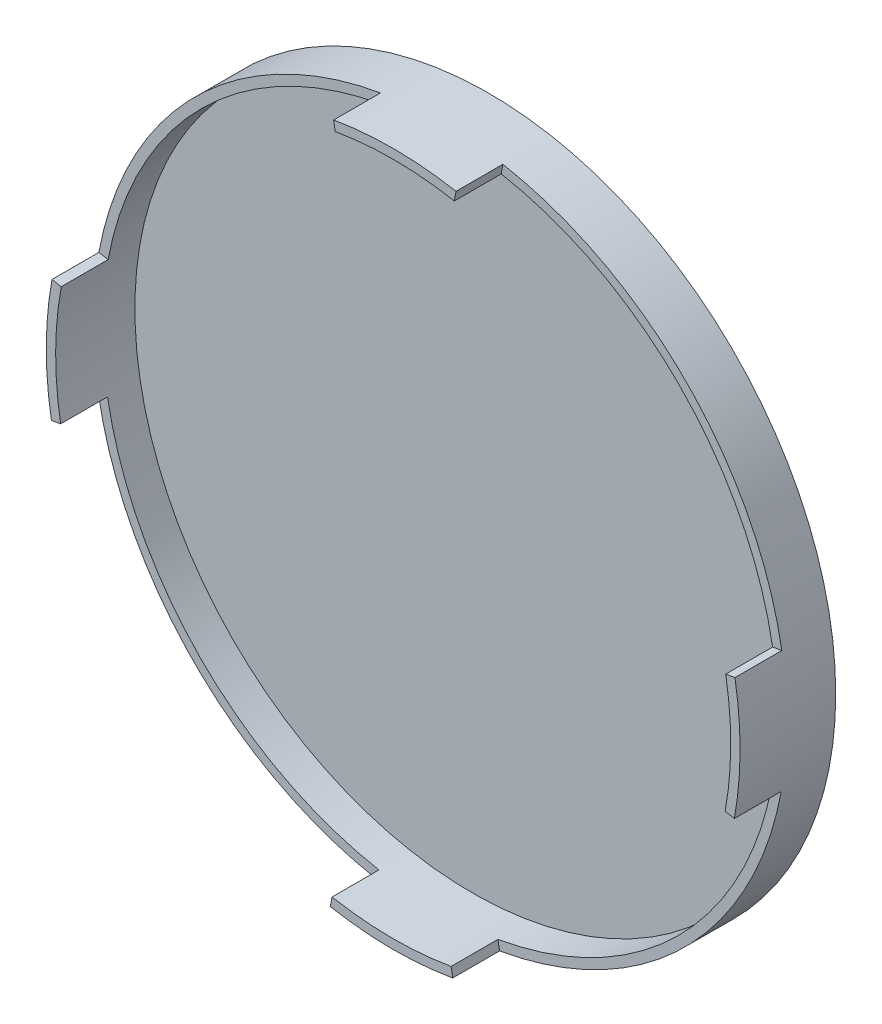
ISO-10303-21;
HEADER;
FILE_DESCRIPTION(('STEP AP214'),'2;1');
FILE_NAME('part.step','',(''),(''),'','','');
FILE_SCHEMA(('AUTOMOTIVE_DESIGN { 1 0 10303 214 1 1 1 1 }'));
ENDSEC;
DATA;
#1=APPLICATION_CONTEXT('core data for automotive mechanical design processes');
#2=APPLICATION_PROTOCOL_DEFINITION('international standard','automotive_design',2000,#1);
#3=PRODUCT_CONTEXT('',#1,'mechanical');
#4=PRODUCT('Part','Part','',(#3));
#5=PRODUCT_RELATED_PRODUCT_CATEGORY('part','',(#4));
#6=PRODUCT_DEFINITION_FORMATION('','',#4);
#7=PRODUCT_DEFINITION_CONTEXT('part definition',#1,'design');
#8=PRODUCT_DEFINITION('design','',#6,#7);
#9=PRODUCT_DEFINITION_SHAPE('','',#8);
#10=(LENGTH_UNIT() NAMED_UNIT(*) SI_UNIT(.MILLI.,.METRE.));
#11=(NAMED_UNIT(*) PLANE_ANGLE_UNIT() SI_UNIT($,.RADIAN.));
#12=(NAMED_UNIT(*) SI_UNIT($,.STERADIAN.) SOLID_ANGLE_UNIT());
#13=UNCERTAINTY_MEASURE_WITH_UNIT(LENGTH_MEASURE(1.E-05),#10,'distance_accuracy_value','');
#14=(GEOMETRIC_REPRESENTATION_CONTEXT(3) GLOBAL_UNCERTAINTY_ASSIGNED_CONTEXT((#13)) GLOBAL_UNIT_ASSIGNED_CONTEXT((#10,
#11,#12)) REPRESENTATION_CONTEXT('',''));
#15=CARTESIAN_POINT('',(0.,0.,0.));
#16=DIRECTION('',(0.,0.,1.));
#17=DIRECTION('',(1.,0.,0.));
#18=AXIS2_PLACEMENT_3D('',#15,#16,#17);
#19=CARTESIAN_POINT('',(0.,0.,0.));
#20=DIRECTION('',(0.,0.,1.));
#21=DIRECTION('',(1.,0.,0.));
#22=AXIS2_PLACEMENT_3D('',#19,#20,#21);
#23=PLANE('',#22);
#24=CARTESIAN_POINT('',(0.,0.,0.));
#25=DIRECTION('',(0.,0.,1.));
#26=DIRECTION('',(1.,0.,0.));
#27=AXIS2_PLACEMENT_3D('',#24,#25,#26);
#28=CIRCLE('',#27,49.5);
#29=CARTESIAN_POINT('',(49.5,0.,0.));
#30=VERTEX_POINT('',#29);
#31=EDGE_CURVE('E399',#30,#30,#28,.T.);
#32=ORIENTED_EDGE('',*,*,#31,.T.);
#33=EDGE_LOOP('',(#32));
#34=FACE_BOUND('',#33,.T.);
#35=CARTESIAN_POINT('',(0.,0.,0.));
#36=DIRECTION('',(0.,0.,1.));
#37=DIRECTION('',(1.,0.,0.));
#38=AXIS2_PLACEMENT_3D('',#35,#36,#37);
#39=CIRCLE('',#38,58.5);
#40=CARTESIAN_POINT('',(58.5,0.,0.));
#41=VERTEX_POINT('',#40);
#42=EDGE_CURVE('E395',#41,#41,#39,.F.);
#43=ORIENTED_EDGE('',*,*,#42,.T.);
#44=EDGE_LOOP('',(#43));
#45=FACE_BOUND('',#44,.T.);
#46=ADVANCED_FACE('F73',(#34,#45),#23,.F.);
#47=CARTESIAN_POINT('',(0.,0.,0.));
#48=DIRECTION('',(0.,0.,1.));
#49=DIRECTION('',(1.,0.,0.));
#50=AXIS2_PLACEMENT_3D('',#47,#48,#49);
#51=CIRCLE('',#50,38.5);
#52=CARTESIAN_POINT('',(38.5,0.,0.));
#53=VERTEX_POINT('',#52);
#54=EDGE_CURVE('E383',#53,#53,#51,.T.);
#55=ORIENTED_EDGE('',*,*,#54,.T.);
#56=EDGE_LOOP('',(#55));
#57=FACE_BOUND('',#56,.T.);
#58=CARTESIAN_POINT('',(0.,0.,0.));
#59=DIRECTION('',(0.,0.,1.));
#60=DIRECTION('',(1.,0.,0.));
#61=AXIS2_PLACEMENT_3D('',#58,#59,#60);
#62=CIRCLE('',#61,47.5);
#63=CARTESIAN_POINT('',(47.5,0.,0.));
#64=VERTEX_POINT('',#63);
#65=EDGE_CURVE('E379',#64,#64,#62,.F.);
#66=ORIENTED_EDGE('',*,*,#65,.T.);
#67=EDGE_LOOP('',(#66));
#68=FACE_BOUND('',#67,.T.);
#69=ADVANCED_FACE('F427',(#57,#68),#23,.F.);
#70=CARTESIAN_POINT('',(0.,0.,0.));
#71=DIRECTION('',(0.,0.,1.));
#72=DIRECTION('',(1.,0.,0.));
#73=AXIS2_PLACEMENT_3D('',#70,#71,#72);
#74=CIRCLE('',#73,27.5);
#75=CARTESIAN_POINT('',(27.5,0.,0.));
#76=VERTEX_POINT('',#75);
#77=EDGE_CURVE('E367',#76,#76,#74,.T.);
#78=ORIENTED_EDGE('',*,*,#77,.T.);
#79=EDGE_LOOP('',(#78));
#80=FACE_BOUND('',#79,.T.);
#81=CARTESIAN_POINT('',(0.,0.,0.));
#82=DIRECTION('',(0.,0.,1.));
#83=DIRECTION('',(1.,0.,0.));
#84=AXIS2_PLACEMENT_3D('',#81,#82,#83);
#85=CIRCLE('',#84,36.5);
#86=CARTESIAN_POINT('',(36.5,0.,0.));
#87=VERTEX_POINT('',#86);
#88=EDGE_CURVE('E363',#87,#87,#85,.F.);
#89=ORIENTED_EDGE('',*,*,#88,.T.);
#90=EDGE_LOOP('',(#89));
#91=FACE_BOUND('',#90,.T.);
#92=ADVANCED_FACE('F433',(#80,#91),#23,.F.);
#93=CARTESIAN_POINT('',(0.,0.,1.));
#94=DIRECTION('',(0.,0.,1.));
#95=DIRECTION('',(1.,0.,0.));
#96=AXIS2_PLACEMENT_3D('',#93,#94,#95);
#97=PLANE('',#96);
#98=CARTESIAN_POINT('',(0.,0.,1.));
#99=DIRECTION('',(0.,0.,1.));
#100=DIRECTION('',(1.,0.,0.));
#101=AXIS2_PLACEMENT_3D('',#98,#99,#100);
#102=CIRCLE('',#101,27.);
#103=CARTESIAN_POINT('',(27.,0.,1.));
#104=VERTEX_POINT('',#103);
#105=EDGE_CURVE('E525',#104,#104,#102,.T.);
#106=ORIENTED_EDGE('',*,*,#105,.F.);
#107=EDGE_LOOP('',(#106));
#108=FACE_BOUND('',#107,.T.);
#109=CARTESIAN_POINT('',(0.,0.,1.));
#110=DIRECTION('',(0.,0.,1.));
#111=DIRECTION('',(1.,0.,0.));
#112=AXIS2_PLACEMENT_3D('',#109,#110,#111);
#113=CIRCLE('',#112,26.);
#114=CARTESIAN_POINT('',(26.,0.,1.));
#115=VERTEX_POINT('',#114);
#116=EDGE_CURVE('E515',#115,#115,#113,.T.);
#117=ORIENTED_EDGE('',*,*,#116,.T.);
#118=EDGE_LOOP('',(#117));
#119=FACE_BOUND('',#118,.T.);
#120=ADVANCED_FACE('F480',(#108,#119),#97,.F.);
#121=CARTESIAN_POINT('',(0.,0.,1.));
#122=DIRECTION('',(0.,0.,-1.));
#123=DIRECTION('',(-1.,0.,0.));
#124=AXIS2_PLACEMENT_3D('',#121,#122,#123);
#125=CYLINDRICAL_SURFACE('',#124,27.);
#126=CARTESIAN_POINT('',(0.,0.,0.5));
#127=DIRECTION('',(0.,0.,1.));
#128=DIRECTION('',(1.,0.,0.));
#129=AXIS2_PLACEMENT_3D('',#126,#127,#128);
#130=CIRCLE('',#129,27.);
#131=CARTESIAN_POINT('',(27.,0.,0.5));
#132=VERTEX_POINT('',#131);
#133=EDGE_CURVE('E371',#132,#132,#130,.F.);
#134=ORIENTED_EDGE('',*,*,#133,.T.);
#135=EDGE_LOOP('',(#134));
#136=FACE_BOUND('',#135,.T.);
#137=ORIENTED_EDGE('',*,*,#105,.T.);
#138=EDGE_LOOP('',(#137));
#139=FACE_BOUND('',#138,.T.);
#140=ADVANCED_FACE('F462',(#136,#139),#125,.F.);
#141=CARTESIAN_POINT('',(0.,0.,1.));
#142=DIRECTION('',(0.,0.,-1.));
#143=DIRECTION('',(-1.,0.,0.));
#144=AXIS2_PLACEMENT_3D('',#141,#142,#143);
#145=CYLINDRICAL_SURFACE('',#144,26.);
#146=CARTESIAN_POINT('',(0.,0.,0.5));
#147=DIRECTION('',(0.,0.,1.));
#148=DIRECTION('',(1.,0.,0.));
#149=AXIS2_PLACEMENT_3D('',#146,#147,#148);
#150=CIRCLE('',#149,26.);
#151=CARTESIAN_POINT('',(26.,0.,0.5));
#152=VERTEX_POINT('',#151);
#153=EDGE_CURVE('E355',#152,#152,#150,.T.);
#154=ORIENTED_EDGE('',*,*,#153,.T.);
#155=EDGE_LOOP('',(#154));
#156=FACE_BOUND('',#155,.T.);
#157=ORIENTED_EDGE('',*,*,#116,.F.);
#158=EDGE_LOOP('',(#157));
#159=FACE_BOUND('',#158,.T.);
#160=ADVANCED_FACE('F452',(#156,#159),#145,.T.);
#161=CARTESIAN_POINT('',(0.,0.,0.));
#162=DIRECTION('',(0.,0.,1.));
#163=DIRECTION('',(1.,0.,0.));
#164=AXIS2_PLACEMENT_3D('',#161,#162,#163);
#165=CIRCLE('',#164,14.5);
#166=CARTESIAN_POINT('',(14.5,0.,0.));
#167=VERTEX_POINT('',#166);
#168=EDGE_CURVE('E343',#167,#167,#165,.F.);
#169=ORIENTED_EDGE('',*,*,#168,.T.);
#170=EDGE_LOOP('',(#169));
#171=FACE_BOUND('',#170,.T.);
#172=ADVANCED_FACE('F440',(#171),#23,.F.);
#173=CARTESIAN_POINT('',(0.,0.,1.));
#174=DIRECTION('',(0.,0.,-1.));
#175=DIRECTION('',(-1.,0.,0.));
#176=AXIS2_PLACEMENT_3D('',#173,#174,#175);
#177=CYLINDRICAL_SURFACE('',#176,15.);
#178=CARTESIAN_POINT('',(0.,0.,0.5));
#179=DIRECTION('',(0.,0.,1.));
#180=DIRECTION('',(1.,0.,0.));
#181=AXIS2_PLACEMENT_3D('',#178,#179,#180);
#182=CIRCLE('',#181,15.);
#183=CARTESIAN_POINT('',(15.,0.,0.5));
#184=VERTEX_POINT('',#183);
#185=EDGE_CURVE('E336',#184,#184,#182,.T.);
#186=ORIENTED_EDGE('',*,*,#185,.T.);
#187=EDGE_LOOP('',(#186));
#188=FACE_BOUND('',#187,.T.);
#189=CARTESIAN_POINT('',(0.,0.,1.));
#190=DIRECTION('',(0.,0.,1.));
#191=DIRECTION('',(1.,0.,0.));
#192=AXIS2_PLACEMENT_3D('',#189,#190,#191);
#193=CIRCLE('',#192,15.);
#194=CARTESIAN_POINT('',(15.,0.,1.));
#195=VERTEX_POINT('',#194);
#196=EDGE_CURVE('E529',#195,#195,#193,.T.);
#197=ORIENTED_EDGE('',*,*,#196,.F.);
#198=EDGE_LOOP('',(#197));
#199=FACE_BOUND('',#198,.T.);
#200=ADVANCED_FACE('F451',(#188,#199),#177,.T.);
#201=CARTESIAN_POINT('',(0.,0.,1.));
#202=DIRECTION('',(0.,0.,1.));
#203=DIRECTION('',(1.,0.,0.));
#204=AXIS2_PLACEMENT_3D('',#201,#202,#203);
#205=PLANE('',#204);
#206=CARTESIAN_POINT('',(0.,0.,1.));
#207=DIRECTION('',(0.,0.,1.));
#208=DIRECTION('',(1.,0.,0.));
#209=AXIS2_PLACEMENT_3D('',#206,#207,#208);
#210=CIRCLE('',#209,15.5);
#211=CARTESIAN_POINT('',(15.5,0.,1.));
#212=VERTEX_POINT('',#211);
#213=EDGE_CURVE('E351',#212,#212,#210,.F.);
#214=ORIENTED_EDGE('',*,*,#213,.T.);
#215=EDGE_LOOP('',(#214));
#216=FACE_BOUND('',#215,.T.);
#217=ORIENTED_EDGE('',*,*,#196,.T.);
#218=EDGE_LOOP('',(#217));
#219=FACE_BOUND('',#218,.T.);
#220=ADVANCED_FACE('F459',(#216,#219),#205,.F.);
#221=CARTESIAN_POINT('',(0.,0.,1.));
#222=DIRECTION('',(0.,0.,-1.));
#223=DIRECTION('',(-1.,0.,0.));
#224=AXIS2_PLACEMENT_3D('',#221,#222,#223);
#225=CYLINDRICAL_SURFACE('',#224,16.);
#226=CARTESIAN_POINT('',(0.,0.,0.5));
#227=DIRECTION('',(0.,0.,1.));
#228=DIRECTION('',(1.,0.,0.));
#229=AXIS2_PLACEMENT_3D('',#226,#227,#228);
#230=CIRCLE('',#229,16.);
#231=CARTESIAN_POINT('',(16.,0.,0.5));
#232=VERTEX_POINT('',#231);
#233=EDGE_CURVE('E347',#232,#232,#230,.T.);
#234=ORIENTED_EDGE('',*,*,#233,.T.);
#235=EDGE_LOOP('',(#234));
#236=FACE_BOUND('',#235,.T.);
#237=CARTESIAN_POINT('',(0.,0.,0.));
#238=DIRECTION('',(0.,0.,1.));
#239=DIRECTION('',(1.,0.,0.));
#240=AXIS2_PLACEMENT_3D('',#237,#238,#239);
#241=CIRCLE('',#240,16.);
#242=CARTESIAN_POINT('',(16.,0.,0.));
#243=VERTEX_POINT('',#242);
#244=EDGE_CURVE('E533',#243,#243,#241,.T.);
#245=ORIENTED_EDGE('',*,*,#244,.F.);
#246=EDGE_LOOP('',(#245));
#247=FACE_BOUND('',#246,.T.);
#248=ADVANCED_FACE('F467',(#236,#247),#225,.F.);
#249=CARTESIAN_POINT('',(0.,0.,0.));
#250=DIRECTION('',(0.,0.,1.));
#251=DIRECTION('',(1.,0.,0.));
#252=AXIS2_PLACEMENT_3D('',#249,#250,#251);
#253=CIRCLE('',#252,25.5);
#254=CARTESIAN_POINT('',(25.5,0.,0.));
#255=VERTEX_POINT('',#254);
#256=EDGE_CURVE('E359',#255,#255,#253,.F.);
#257=ORIENTED_EDGE('',*,*,#256,.T.);
#258=EDGE_LOOP('',(#257));
#259=FACE_BOUND('',#258,.T.);
#260=ORIENTED_EDGE('',*,*,#244,.T.);
#261=EDGE_LOOP('',(#260));
#262=FACE_BOUND('',#261,.T.);
#263=ADVANCED_FACE('F454',(#259,#262),#23,.F.);
#264=CARTESIAN_POINT('',(0.,0.,1.));
#265=DIRECTION('',(0.,0.,1.));
#266=DIRECTION('',(1.,0.,0.));
#267=AXIS2_PLACEMENT_3D('',#264,#265,#266);
#268=PLANE('',#267);
#269=CARTESIAN_POINT('',(0.,0.,1.));
#270=DIRECTION('',(0.,0.,1.));
#271=DIRECTION('',(1.,0.,0.));
#272=AXIS2_PLACEMENT_3D('',#269,#270,#271);
#273=CIRCLE('',#272,38.);
#274=CARTESIAN_POINT('',(38.,0.,1.));
#275=VERTEX_POINT('',#274);
#276=EDGE_CURVE('E509',#275,#275,#273,.T.);
#277=ORIENTED_EDGE('',*,*,#276,.F.);
#278=EDGE_LOOP('',(#277));
#279=FACE_BOUND('',#278,.T.);
#280=CARTESIAN_POINT('',(0.,0.,1.));
#281=DIRECTION('',(0.,0.,1.));
#282=DIRECTION('',(1.,0.,0.));
#283=AXIS2_PLACEMENT_3D('',#280,#281,#282);
#284=CIRCLE('',#283,37.);
#285=CARTESIAN_POINT('',(37.,0.,1.));
#286=VERTEX_POINT('',#285);
#287=EDGE_CURVE('E506',#286,#286,#284,.T.);
#288=ORIENTED_EDGE('',*,*,#287,.T.);
#289=EDGE_LOOP('',(#288));
#290=FACE_BOUND('',#289,.T.);
#291=ADVANCED_FACE('F466',(#279,#290),#268,.F.);
#292=CARTESIAN_POINT('',(0.,0.,1.));
#293=DIRECTION('',(0.,0.,-1.));
#294=DIRECTION('',(-1.,0.,0.));
#295=AXIS2_PLACEMENT_3D('',#292,#293,#294);
#296=CYLINDRICAL_SURFACE('',#295,38.);
#297=CARTESIAN_POINT('',(0.,0.,0.5));
#298=DIRECTION('',(0.,0.,1.));
#299=DIRECTION('',(1.,0.,0.));
#300=AXIS2_PLACEMENT_3D('',#297,#298,#299);
#301=CIRCLE('',#300,38.);
#302=CARTESIAN_POINT('',(38.,0.,0.5));
#303=VERTEX_POINT('',#302);
#304=EDGE_CURVE('E387',#303,#303,#301,.F.);
#305=ORIENTED_EDGE('',*,*,#304,.T.);
#306=EDGE_LOOP('',(#305));
#307=FACE_BOUND('',#306,.T.);
#308=ORIENTED_EDGE('',*,*,#276,.T.);
#309=EDGE_LOOP('',(#308));
#310=FACE_BOUND('',#309,.T.);
#311=ADVANCED_FACE('F473',(#307,#310),#296,.F.);
#312=CARTESIAN_POINT('',(0.,0.,1.));
#313=DIRECTION('',(0.,0.,-1.));
#314=DIRECTION('',(-1.,0.,0.));
#315=AXIS2_PLACEMENT_3D('',#312,#313,#314);
#316=CYLINDRICAL_SURFACE('',#315,37.);
#317=CARTESIAN_POINT('',(0.,0.,0.5));
#318=DIRECTION('',(0.,0.,1.));
#319=DIRECTION('',(1.,0.,0.));
#320=AXIS2_PLACEMENT_3D('',#317,#318,#319);
#321=CIRCLE('',#320,37.);
#322=CARTESIAN_POINT('',(37.,0.,0.5));
#323=VERTEX_POINT('',#322);
#324=EDGE_CURVE('E375',#323,#323,#321,.T.);
#325=ORIENTED_EDGE('',*,*,#324,.T.);
#326=EDGE_LOOP('',(#325));
#327=FACE_BOUND('',#326,.T.);
#328=ORIENTED_EDGE('',*,*,#287,.F.);
#329=EDGE_LOOP('',(#328));
#330=FACE_BOUND('',#329,.T.);
#331=ADVANCED_FACE('F499',(#327,#330),#316,.T.);
#332=CARTESIAN_POINT('',(0.,0.,1.));
#333=DIRECTION('',(0.,0.,1.));
#334=DIRECTION('',(1.,0.,0.));
#335=AXIS2_PLACEMENT_3D('',#332,#333,#334);
#336=PLANE('',#335);
#337=CARTESIAN_POINT('',(0.,0.,1.));
#338=DIRECTION('',(0.,0.,1.));
#339=DIRECTION('',(1.,0.,0.));
#340=AXIS2_PLACEMENT_3D('',#337,#338,#339);
#341=CIRCLE('',#340,49.);
#342=CARTESIAN_POINT('',(49.,0.,1.));
#343=VERTEX_POINT('',#342);
#344=EDGE_CURVE('E510',#343,#343,#341,.T.);
#345=ORIENTED_EDGE('',*,*,#344,.F.);
#346=EDGE_LOOP('',(#345));
#347=FACE_BOUND('',#346,.T.);
#348=CARTESIAN_POINT('',(0.,0.,1.));
#349=DIRECTION('',(0.,0.,1.));
#350=DIRECTION('',(1.,0.,0.));
#351=AXIS2_PLACEMENT_3D('',#348,#349,#350);
#352=CIRCLE('',#351,48.);
#353=CARTESIAN_POINT('',(48.,0.,1.));
#354=VERTEX_POINT('',#353);
#355=EDGE_CURVE('E518',#354,#354,#352,.T.);
#356=ORIENTED_EDGE('',*,*,#355,.T.);
#357=EDGE_LOOP('',(#356));
#358=FACE_BOUND('',#357,.T.);
#359=ADVANCED_FACE('F502',(#347,#358),#336,.F.);
#360=CARTESIAN_POINT('',(0.,0.,1.));
#361=DIRECTION('',(0.,0.,-1.));
#362=DIRECTION('',(-1.,0.,0.));
#363=AXIS2_PLACEMENT_3D('',#360,#361,#362);
#364=CYLINDRICAL_SURFACE('',#363,49.);
#365=CARTESIAN_POINT('',(0.,0.,0.5));
#366=DIRECTION('',(0.,0.,1.));
#367=DIRECTION('',(1.,0.,0.));
#368=AXIS2_PLACEMENT_3D('',#365,#366,#367);
#369=CIRCLE('',#368,49.);
#370=CARTESIAN_POINT('',(49.,0.,0.5));
#371=VERTEX_POINT('',#370);
#372=EDGE_CURVE('E403',#371,#371,#369,.F.);
#373=ORIENTED_EDGE('',*,*,#372,.T.);
#374=EDGE_LOOP('',(#373));
#375=FACE_BOUND('',#374,.T.);
#376=ORIENTED_EDGE('',*,*,#344,.T.);
#377=EDGE_LOOP('',(#376));
#378=FACE_BOUND('',#377,.T.);
#379=ADVANCED_FACE('F669',(#375,#378),#364,.F.);
#380=CARTESIAN_POINT('',(0.,0.,1.));
#381=DIRECTION('',(0.,0.,-1.));
#382=DIRECTION('',(-1.,0.,0.));
#383=AXIS2_PLACEMENT_3D('',#380,#381,#382);
#384=CYLINDRICAL_SURFACE('',#383,48.);
#385=CARTESIAN_POINT('',(0.,0.,0.5));
#386=DIRECTION('',(0.,0.,1.));
#387=DIRECTION('',(1.,0.,0.));
#388=AXIS2_PLACEMENT_3D('',#385,#386,#387);
#389=CIRCLE('',#388,48.);
#390=CARTESIAN_POINT('',(48.,0.,0.5));
#391=VERTEX_POINT('',#390);
#392=EDGE_CURVE('E391',#391,#391,#389,.T.);
#393=ORIENTED_EDGE('',*,*,#392,.T.);
#394=EDGE_LOOP('',(#393));
#395=FACE_BOUND('',#394,.T.);
#396=ORIENTED_EDGE('',*,*,#355,.F.);
#397=EDGE_LOOP('',(#396));
#398=FACE_BOUND('',#397,.T.);
#399=ADVANCED_FACE('F664',(#395,#398),#384,.T.);
#400=CARTESIAN_POINT('',(0.,0.,1.));
#401=DIRECTION('',(0.,0.,1.));
#402=DIRECTION('',(1.,0.,0.));
#403=AXIS2_PLACEMENT_3D('',#400,#401,#402);
#404=PLANE('',#403);
#405=CARTESIAN_POINT('',(0.,0.,1.));
#406=DIRECTION('',(0.,0.,1.));
#407=DIRECTION('',(1.,0.,0.));
#408=AXIS2_PLACEMENT_3D('',#405,#406,#407);
#409=CIRCLE('',#408,60.);
#410=CARTESIAN_POINT('',(60.,0.,1.));
#411=VERTEX_POINT('',#410);
#412=EDGE_CURVE('E1033',#411,#411,#409,.T.);
#413=ORIENTED_EDGE('',*,*,#412,.F.);
#414=EDGE_LOOP('',(#413));
#415=FACE_BOUND('',#414,.T.);
#416=CARTESIAN_POINT('',(0.,0.,1.));
#417=DIRECTION('',(0.,0.,1.));
#418=DIRECTION('',(1.,0.,0.));
#419=AXIS2_PLACEMENT_3D('',#416,#417,#418);
#420=CIRCLE('',#419,59.);
#421=CARTESIAN_POINT('',(59.,0.,1.));
#422=VERTEX_POINT('',#421);
#423=EDGE_CURVE('E1036',#422,#422,#420,.T.);
#424=ORIENTED_EDGE('',*,*,#423,.T.);
#425=EDGE_LOOP('',(#424));
#426=FACE_BOUND('',#425,.T.);
#427=ADVANCED_FACE('F658',(#415,#426),#404,.F.);
#428=CARTESIAN_POINT('',(0.,0.,1.));
#429=DIRECTION('',(0.,0.,-1.));
#430=DIRECTION('',(-1.,0.,0.));
#431=AXIS2_PLACEMENT_3D('',#428,#429,#430);
#432=CYLINDRICAL_SURFACE('',#431,60.);
#433=CARTESIAN_POINT('',(0.,0.,0.5));
#434=DIRECTION('',(0.,0.,1.));
#435=DIRECTION('',(1.,0.,0.));
#436=AXIS2_PLACEMENT_3D('',#433,#434,#435);
#437=CIRCLE('',#436,60.);
#438=CARTESIAN_POINT('',(60.,0.,0.5));
#439=VERTEX_POINT('',#438);
#440=EDGE_CURVE('E12',#439,#439,#437,.F.);
#441=ORIENTED_EDGE('',*,*,#440,.T.);
#442=EDGE_LOOP('',(#441));
#443=FACE_BOUND('',#442,.T.);
#444=ORIENTED_EDGE('',*,*,#412,.T.);
#445=EDGE_LOOP('',(#444));
#446=FACE_BOUND('',#445,.T.);
#447=ADVANCED_FACE('F651',(#443,#446),#432,.F.);
#448=CARTESIAN_POINT('',(0.,0.,1.));
#449=DIRECTION('',(0.,0.,-1.));
#450=DIRECTION('',(-1.,0.,0.));
#451=AXIS2_PLACEMENT_3D('',#448,#449,#450);
#452=CYLINDRICAL_SURFACE('',#451,59.);
#453=CARTESIAN_POINT('',(0.,0.,0.5));
#454=DIRECTION('',(0.,0.,1.));
#455=DIRECTION('',(1.,0.,0.));
#456=AXIS2_PLACEMENT_3D('',#453,#454,#455);
#457=CIRCLE('',#456,59.);
#458=CARTESIAN_POINT('',(59.,0.,0.5));
#459=VERTEX_POINT('',#458);
#460=EDGE_CURVE('E407',#459,#459,#457,.T.);
#461=ORIENTED_EDGE('',*,*,#460,.T.);
#462=EDGE_LOOP('',(#461));
#463=FACE_BOUND('',#462,.T.);
#464=ORIENTED_EDGE('',*,*,#423,.F.);
#465=EDGE_LOOP('',(#464));
#466=FACE_BOUND('',#465,.T.);
#467=ADVANCED_FACE('F646',(#463,#466),#452,.T.);
#468=CARTESIAN_POINT('',(0.,0.,3.5));
#469=DIRECTION('',(0.,0.,1.));
#470=DIRECTION('',(1.,0.,0.));
#471=AXIS2_PLACEMENT_3D('',#468,#469,#470);
#472=PLANE('',#471);
#473=CARTESIAN_POINT('',(0.,0.,3.5));
#474=DIRECTION('',(0.,0.,1.));
#475=DIRECTION('',(1.,0.,0.));
#476=AXIS2_PLACEMENT_3D('',#473,#474,#475);
#477=CIRCLE('',#476,72.);
#478=CARTESIAN_POINT('',(72.,0.,3.5));
#479=VERTEX_POINT('',#478);
#480=EDGE_CURVE('E332',#479,#479,#477,.F.);
#481=ORIENTED_EDGE('',*,*,#480,.F.);
#482=EDGE_LOOP('',(#481));
#483=FACE_BOUND('',#482,.T.);
#484=ADVANCED_FACE('F642',(#483),#472,.T.);
#485=CARTESIAN_POINT('',(0.,0.,10.4));
#486=DIRECTION('',(0.,0.,-1.));
#487=DIRECTION('',(-1.,0.,0.));
#488=AXIS2_PLACEMENT_3D('',#485,#486,#487);
#489=CYLINDRICAL_SURFACE('',#488,72.);
#490=ORIENTED_EDGE('',*,*,#480,.T.);
#491=EDGE_LOOP('',(#490));
#492=FACE_BOUND('',#491,.T.);
#493=CARTESIAN_POINT('',(0.,0.,10.4));
#494=DIRECTION('',(0.,0.,1.));
#495=DIRECTION('',(1.,0.,0.));
#496=AXIS2_PLACEMENT_3D('',#493,#494,#495);
#497=CIRCLE('',#496,72.);
#498=CARTESIAN_POINT('',(-12.354120348902,70.9321909319375,10.4));
#499=VERTEX_POINT('',#498);
#500=CARTESIAN_POINT('',(-70.8082270935311,13.0458796510977,10.4));
#501=VERTEX_POINT('',#500);
#502=EDGE_CURVE('E321',#499,#501,#497,.T.);
#503=ORIENTED_EDGE('',*,*,#502,.T.);
#504=DIRECTION('',(0.,0.,-1.));
#505=VECTOR('',#504,1.);
#506=CARTESIAN_POINT('',(-70.8082270935311,13.0458796510977,20.4));
#507=LINE('',#506,#505);
#508=CARTESIAN_POINT('',(-70.8082270935311,13.0458796510977,20.4));
#509=VERTEX_POINT('',#508);
#510=EDGE_CURVE('E275',#509,#501,#507,.T.);
#511=ORIENTED_EDGE('',*,*,#510,.F.);
#512=CARTESIAN_POINT('',(0.,0.,20.4));
#513=DIRECTION('',(0.,0.,-1.));
#514=DIRECTION('',(0.,-1.,0.));
#515=AXIS2_PLACEMENT_3D('',#512,#513,#514);
#516=CIRCLE('',#515,72.);
#517=CARTESIAN_POINT('',(-70.9321909319375,-12.3541203489023,20.4));
#518=VERTEX_POINT('',#517);
#519=EDGE_CURVE('E260',#518,#509,#516,.T.);
#520=ORIENTED_EDGE('',*,*,#519,.F.);
#521=DIRECTION('',(0.,0.,-1.));
#522=VECTOR('',#521,1.);
#523=CARTESIAN_POINT('',(-70.9321909319375,-12.3541203489023,20.4));
#524=LINE('',#523,#522);
#525=CARTESIAN_POINT('',(-70.9321909319375,-12.3541203489023,10.4));
#526=VERTEX_POINT('',#525);
#527=EDGE_CURVE('E278',#518,#526,#524,.T.);
#528=ORIENTED_EDGE('',*,*,#527,.T.);
#529=CARTESIAN_POINT('',(-13.045879651098,-70.808227093531,10.4));
#530=VERTEX_POINT('',#529);
#531=EDGE_CURVE('E325',#526,#530,#497,.T.);
#532=ORIENTED_EDGE('',*,*,#531,.T.);
#533=DIRECTION('',(0.,0.,-1.));
#534=VECTOR('',#533,1.);
#535=CARTESIAN_POINT('',(-13.045879651098,-70.808227093531,20.4));
#536=LINE('',#535,#534);
#537=CARTESIAN_POINT('',(-13.045879651098,-70.808227093531,20.4));
#538=VERTEX_POINT('',#537);
#539=EDGE_CURVE('E243',#538,#530,#536,.T.);
#540=ORIENTED_EDGE('',*,*,#539,.F.);
#541=CARTESIAN_POINT('',(0.,0.,20.4));
#542=DIRECTION('',(0.,0.,-1.));
#543=DIRECTION('',(1.,0.,0.));
#544=AXIS2_PLACEMENT_3D('',#541,#542,#543);
#545=CIRCLE('',#544,72.);
#546=CARTESIAN_POINT('',(12.354120348902,-70.9321909319375,20.4));
#547=VERTEX_POINT('',#546);
#548=EDGE_CURVE('E231',#547,#538,#545,.T.);
#549=ORIENTED_EDGE('',*,*,#548,.F.);
#550=DIRECTION('',(0.,0.,-1.));
#551=VECTOR('',#550,1.);
#552=CARTESIAN_POINT('',(12.354120348902,-70.9321909319375,20.4));
#553=LINE('',#552,#551);
#554=CARTESIAN_POINT('',(12.354120348902,-70.9321909319375,10.4));
#555=VERTEX_POINT('',#554);
#556=EDGE_CURVE('E96',#547,#555,#553,.T.);
#557=ORIENTED_EDGE('',*,*,#556,.T.);
#558=CARTESIAN_POINT('',(70.8082270935312,-13.0458796510973,10.4));
#559=VERTEX_POINT('',#558);
#560=EDGE_CURVE('E558',#555,#559,#497,.T.);
#561=ORIENTED_EDGE('',*,*,#560,.T.);
#562=DIRECTION('',(0.,0.,-1.));
#563=VECTOR('',#562,1.);
#564=CARTESIAN_POINT('',(70.8082270935312,-13.0458796510973,20.4));
#565=LINE('',#564,#563);
#566=CARTESIAN_POINT('',(70.8082270935312,-13.0458796510973,20.4));
#567=VERTEX_POINT('',#566);
#568=EDGE_CURVE('E220',#567,#559,#565,.T.);
#569=ORIENTED_EDGE('',*,*,#568,.F.);
#570=CARTESIAN_POINT('',(0.,0.,20.4));
#571=DIRECTION('',(0.,0.,-1.));
#572=DIRECTION('',(0.,1.,0.));
#573=AXIS2_PLACEMENT_3D('',#570,#571,#572);
#574=CIRCLE('',#573,72.);
#575=CARTESIAN_POINT('',(70.9321909319374,12.3541203489027,20.4));
#576=VERTEX_POINT('',#575);
#577=EDGE_CURVE('E195',#576,#567,#574,.T.);
#578=ORIENTED_EDGE('',*,*,#577,.F.);
#579=DIRECTION('',(0.,0.,-1.));
#580=VECTOR('',#579,1.);
#581=CARTESIAN_POINT('',(70.9321909319374,12.3541203489027,20.4));
#582=LINE('',#581,#580);
#583=CARTESIAN_POINT('',(70.9321909319374,12.3541203489027,10.4));
#584=VERTEX_POINT('',#583);
#585=EDGE_CURVE('E89',#576,#584,#582,.T.);
#586=ORIENTED_EDGE('',*,*,#585,.T.);
#587=CARTESIAN_POINT('',(13.045879651098,70.8082270935311,10.4));
#588=VERTEX_POINT('',#587);
#589=EDGE_CURVE('E320',#584,#588,#497,.T.);
#590=ORIENTED_EDGE('',*,*,#589,.T.);
#591=DIRECTION('',(0.,0.,-1.));
#592=VECTOR('',#591,1.);
#593=CARTESIAN_POINT('',(13.045879651098,70.808227093531,20.4));
#594=LINE('',#593,#592);
#595=CARTESIAN_POINT('',(13.045879651098,70.808227093531,20.4));
#596=VERTEX_POINT('',#595);
#597=EDGE_CURVE('E308',#596,#588,#594,.T.);
#598=ORIENTED_EDGE('',*,*,#597,.F.);
#599=CARTESIAN_POINT('',(0.,0.,20.4));
#600=DIRECTION('',(0.,0.,-1.));
#601=DIRECTION('',(-1.,0.,0.));
#602=AXIS2_PLACEMENT_3D('',#599,#600,#601);
#603=CIRCLE('',#602,72.);
#604=CARTESIAN_POINT('',(-12.354120348902,70.9321909319375,20.4));
#605=VERTEX_POINT('',#604);
#606=EDGE_CURVE('E293',#605,#596,#603,.T.);
#607=ORIENTED_EDGE('',*,*,#606,.F.);
#608=DIRECTION('',(0.,0.,-1.));
#609=VECTOR('',#608,1.);
#610=CARTESIAN_POINT('',(-12.354120348902,70.9321909319375,20.4));
#611=LINE('',#610,#609);
#612=EDGE_CURVE('E312',#605,#499,#611,.T.);
#613=ORIENTED_EDGE('',*,*,#612,.T.);
#614=EDGE_LOOP('',(#503,#511,#520,#528,#532,#540,#549,#557,#561,#569,#578,#586,#590,#598,#607,#613));
#615=FACE_BOUND('',#614,.T.);
#616=ADVANCED_FACE('F561',(#492,#615),#489,.F.);
#617=CARTESIAN_POINT('',(-70.8082270935311,13.0458796510977,20.4));
#618=DIRECTION('',(-0.181192772931913,-0.983447598521266,0.));
#619=DIRECTION('',(0.983447598521266,-0.181192772931913,0.));
#620=AXIS2_PLACEMENT_3D('',#617,#618,#619);
#621=PLANE('',#620);
#622=DIRECTION('',(-0.983447598521266,0.181192772931913,0.));
#623=VECTOR('',#622,1.);
#624=CARTESIAN_POINT('',(-70.8082270935311,13.0458796510977,10.4));
#625=LINE('',#624,#623);
#626=CARTESIAN_POINT('',(-72.7751222905737,13.4082651969616,10.4));
#627=VERTEX_POINT('',#626);
#628=EDGE_CURVE('E257',#501,#627,#625,.T.);
#629=ORIENTED_EDGE('',*,*,#628,.T.);
#630=DIRECTION('',(0.,0.,-1.));
#631=VECTOR('',#630,1.);
#632=CARTESIAN_POINT('',(-72.7751222905737,13.4082651969616,20.4));
#633=LINE('',#632,#631);
#634=CARTESIAN_POINT('',(-72.7751222905737,13.4082651969616,20.4));
#635=VERTEX_POINT('',#634);
#636=EDGE_CURVE('E266',#635,#627,#633,.T.);
#637=ORIENTED_EDGE('',*,*,#636,.F.);
#638=DIRECTION('',(-0.983447598521266,0.181192772931913,0.));
#639=VECTOR('',#638,1.);
#640=CARTESIAN_POINT('',(-70.8082270935311,13.0458796510977,20.4));
#641=LINE('',#640,#639);
#642=EDGE_CURVE('E263',#509,#635,#641,.T.);
#643=ORIENTED_EDGE('',*,*,#642,.F.);
#644=ORIENTED_EDGE('',*,*,#510,.T.);
#645=EDGE_LOOP('',(#629,#637,#643,#644));
#646=FACE_BOUND('',#645,.T.);
#647=ADVANCED_FACE('F591',(#646),#621,.F.);
#648=CARTESIAN_POINT('',(0.,0.,20.4));
#649=DIRECTION('',(0.,0.,1.));
#650=DIRECTION('',(0.,1.,0.));
#651=AXIS2_PLACEMENT_3D('',#648,#649,#650);
#652=PLANE('',#651);
#653=CARTESIAN_POINT('',(0.,0.,20.4));
#654=DIRECTION('',(0.,0.,1.));
#655=DIRECTION('',(0.,1.,0.));
#656=AXIS2_PLACEMENT_3D('',#653,#654,#655);
#657=CIRCLE('',#656,74.);
#658=CARTESIAN_POINT('',(-72.9025295689358,-12.697290358594,20.4));
#659=VERTEX_POINT('',#658);
#660=EDGE_CURVE('E252',#635,#659,#657,.T.);
#661=ORIENTED_EDGE('',*,*,#660,.T.);
#662=DIRECTION('',(0.985169318499132,0.171585004845864,0.));
#663=VECTOR('',#662,1.);
#664=CARTESIAN_POINT('',(-70.9321909319375,-12.3541203489023,20.4));
#665=LINE('',#664,#663);
#666=EDGE_CURVE('E256',#659,#518,#665,.T.);
#667=ORIENTED_EDGE('',*,*,#666,.T.);
#668=ORIENTED_EDGE('',*,*,#519,.T.);
#669=ORIENTED_EDGE('',*,*,#642,.T.);
#670=EDGE_LOOP('',(#661,#667,#668,#669));
#671=FACE_BOUND('',#670,.T.);
#672=ADVANCED_FACE('F595',(#671),#652,.T.);
#673=CARTESIAN_POINT('',(-70.9321909319375,-12.3541203489023,20.4));
#674=DIRECTION('',(-0.171585004845864,0.985169318499132,0.));
#675=DIRECTION('',(-0.985169318499132,-0.171585004845864,0.));
#676=AXIS2_PLACEMENT_3D('',#673,#674,#675);
#677=PLANE('',#676);
#678=DIRECTION('',(0.985169318499132,0.171585004845864,0.));
#679=VECTOR('',#678,1.);
#680=CARTESIAN_POINT('',(-70.9321909319375,-12.3541203489023,10.4));
#681=LINE('',#680,#679);
#682=CARTESIAN_POINT('',(-72.9025295689358,-12.697290358594,10.4));
#683=VERTEX_POINT('',#682);
#684=EDGE_CURVE('E251',#683,#526,#681,.T.);
#685=ORIENTED_EDGE('',*,*,#684,.T.);
#686=ORIENTED_EDGE('',*,*,#527,.F.);
#687=ORIENTED_EDGE('',*,*,#666,.F.);
#688=DIRECTION('',(0.,0.,-1.));
#689=VECTOR('',#688,1.);
#690=CARTESIAN_POINT('',(-72.9025295689358,-12.697290358594,20.4));
#691=LINE('',#690,#689);
#692=EDGE_CURVE('E281',#659,#683,#691,.T.);
#693=ORIENTED_EDGE('',*,*,#692,.T.);
#694=EDGE_LOOP('',(#685,#686,#687,#693));
#695=FACE_BOUND('',#694,.T.);
#696=ADVANCED_FACE('F597',(#695),#677,.F.);
#697=CARTESIAN_POINT('',(0.,0.,10.4));
#698=DIRECTION('',(0.,0.,1.));
#699=DIRECTION('',(1.,0.,0.));
#700=AXIS2_PLACEMENT_3D('',#697,#698,#699);
#701=PLANE('',#700);
#702=CARTESIAN_POINT('',(0.,0.,10.4));
#703=DIRECTION('',(0.,0.,1.));
#704=DIRECTION('',(1.,0.,0.));
#705=AXIS2_PLACEMENT_3D('',#702,#703,#704);
#706=CIRCLE('',#705,74.);
#707=CARTESIAN_POINT('',(-13.4082651969618,-72.7751222905736,10.4));
#708=VERTEX_POINT('',#707);
#709=EDGE_CURVE('E331',#683,#708,#706,.T.);
#710=ORIENTED_EDGE('',*,*,#709,.T.);
#711=DIRECTION('',(-0.181192772931916,-0.983447598521265,0.));
#712=VECTOR('',#711,1.);
#713=CARTESIAN_POINT('',(-13.045879651098,-70.8082270935311,10.4));
#714=LINE('',#713,#712);
#715=EDGE_CURVE('E218',#530,#708,#714,.T.);
#716=ORIENTED_EDGE('',*,*,#715,.F.);
#717=ORIENTED_EDGE('',*,*,#531,.F.);
#718=ORIENTED_EDGE('',*,*,#684,.F.);
#719=EDGE_LOOP('',(#710,#716,#717,#718));
#720=FACE_BOUND('',#719,.T.);
#721=ADVANCED_FACE('F604',(#720),#701,.T.);
#722=CARTESIAN_POINT('',(-13.045879651098,-70.8082270935311,20.4));
#723=DIRECTION('',(0.983447598521265,-0.181192772931916,0.));
#724=DIRECTION('',(0.181192772931916,0.983447598521265,0.));
#725=AXIS2_PLACEMENT_3D('',#722,#723,#724);
#726=PLANE('',#725);
#727=ORIENTED_EDGE('',*,*,#715,.T.);
#728=DIRECTION('',(0.,0.,-1.));
#729=VECTOR('',#728,1.);
#730=CARTESIAN_POINT('',(-13.4082651969618,-72.7751222905736,20.4));
#731=LINE('',#730,#729);
#732=CARTESIAN_POINT('',(-13.4082651969618,-72.7751222905736,20.4));
#733=VERTEX_POINT('',#732);
#734=EDGE_CURVE('E236',#733,#708,#731,.T.);
#735=ORIENTED_EDGE('',*,*,#734,.F.);
#736=DIRECTION('',(-0.181192772931916,-0.983447598521265,0.));
#737=VECTOR('',#736,1.);
#738=CARTESIAN_POINT('',(-13.045879651098,-70.8082270935311,20.4));
#739=LINE('',#738,#737);
#740=EDGE_CURVE('E234',#538,#733,#739,.T.);
#741=ORIENTED_EDGE('',*,*,#740,.F.);
#742=ORIENTED_EDGE('',*,*,#539,.T.);
#743=EDGE_LOOP('',(#727,#735,#741,#742));
#744=FACE_BOUND('',#743,.T.);
#745=ADVANCED_FACE('F609',(#744),#726,.F.);
#746=CARTESIAN_POINT('',(0.,0.,20.4));
#747=DIRECTION('',(0.,0.,1.));
#748=DIRECTION('',(-1.,0.,0.));
#749=AXIS2_PLACEMENT_3D('',#746,#747,#748);
#750=PLANE('',#749);
#751=CARTESIAN_POINT('',(0.,0.,20.4));
#752=DIRECTION('',(0.,0.,1.));
#753=DIRECTION('',(-1.,0.,0.));
#754=AXIS2_PLACEMENT_3D('',#751,#752,#753);
#755=CIRCLE('',#754,74.);
#756=CARTESIAN_POINT('',(12.6972903585937,-72.9025295689358,20.4));
#757=VERTEX_POINT('',#756);
#758=EDGE_CURVE('E224',#733,#757,#755,.T.);
#759=ORIENTED_EDGE('',*,*,#758,.T.);
#760=DIRECTION('',(-0.171585004845861,0.985169318499133,0.));
#761=VECTOR('',#760,1.);
#762=CARTESIAN_POINT('',(12.354120348902,-70.9321909319375,20.4));
#763=LINE('',#762,#761);
#764=EDGE_CURVE('E228',#757,#547,#763,.T.);
#765=ORIENTED_EDGE('',*,*,#764,.T.);
#766=ORIENTED_EDGE('',*,*,#548,.T.);
#767=ORIENTED_EDGE('',*,*,#740,.T.);
#768=EDGE_LOOP('',(#759,#765,#766,#767));
#769=FACE_BOUND('',#768,.T.);
#770=ADVANCED_FACE('F612',(#769),#750,.T.);
#771=CARTESIAN_POINT('',(12.354120348902,-70.9321909319375,20.4));
#772=DIRECTION('',(-0.985169318499133,-0.171585004845861,0.));
#773=DIRECTION('',(0.171585004845861,-0.985169318499133,0.));
#774=AXIS2_PLACEMENT_3D('',#771,#772,#773);
#775=PLANE('',#774);
#776=DIRECTION('',(-0.171585004845861,0.985169318499133,0.));
#777=VECTOR('',#776,1.);
#778=CARTESIAN_POINT('',(12.354120348902,-70.9321909319375,10.4));
#779=LINE('',#778,#777);
#780=CARTESIAN_POINT('',(12.6972903585937,-72.9025295689358,10.4));
#781=VERTEX_POINT('',#780);
#782=EDGE_CURVE('E214',#781,#555,#779,.T.);
#783=ORIENTED_EDGE('',*,*,#782,.T.);
#784=ORIENTED_EDGE('',*,*,#556,.F.);
#785=ORIENTED_EDGE('',*,*,#764,.F.);
#786=DIRECTION('',(0.,0.,-1.));
#787=VECTOR('',#786,1.);
#788=CARTESIAN_POINT('',(12.6972903585937,-72.9025295689358,20.4));
#789=LINE('',#788,#787);
#790=EDGE_CURVE('E248',#757,#781,#789,.T.);
#791=ORIENTED_EDGE('',*,*,#790,.T.);
#792=EDGE_LOOP('',(#783,#784,#785,#791));
#793=FACE_BOUND('',#792,.T.);
#794=ADVANCED_FACE('F615',(#793),#775,.F.);
#795=CARTESIAN_POINT('',(72.7751222905738,-13.4082651969611,10.4));
#796=VERTEX_POINT('',#795);
#797=EDGE_CURVE('E560',#781,#796,#706,.T.);
#798=ORIENTED_EDGE('',*,*,#797,.T.);
#799=DIRECTION('',(0.983447598521267,-0.181192772931906,0.));
#800=VECTOR('',#799,1.);
#801=CARTESIAN_POINT('',(70.8082270935312,-13.0458796510973,10.4));
#802=LINE('',#801,#800);
#803=EDGE_CURVE('E206',#559,#796,#802,.T.);
#804=ORIENTED_EDGE('',*,*,#803,.F.);
#805=ORIENTED_EDGE('',*,*,#560,.F.);
#806=ORIENTED_EDGE('',*,*,#782,.F.);
#807=EDGE_LOOP('',(#798,#804,#805,#806));
#808=FACE_BOUND('',#807,.T.);
#809=ADVANCED_FACE('F556',(#808),#701,.T.);
#810=CARTESIAN_POINT('',(70.8082270935312,-13.0458796510973,20.4));
#811=DIRECTION('',(0.181192772931906,0.983447598521267,0.));
#812=DIRECTION('',(-0.983447598521267,0.181192772931906,0.));
#813=AXIS2_PLACEMENT_3D('',#810,#811,#812);
#814=PLANE('',#813);
#815=ORIENTED_EDGE('',*,*,#803,.T.);
#816=DIRECTION('',(0.,0.,-1.));
#817=VECTOR('',#816,1.);
#818=CARTESIAN_POINT('',(72.7751222905738,-13.4082651969611,20.4));
#819=LINE('',#818,#817);
#820=CARTESIAN_POINT('',(72.7751222905738,-13.4082651969611,20.4));
#821=VERTEX_POINT('',#820);
#822=EDGE_CURVE('E542',#821,#796,#819,.T.);
#823=ORIENTED_EDGE('',*,*,#822,.F.);
#824=DIRECTION('',(0.983447598521267,-0.181192772931906,0.));
#825=VECTOR('',#824,1.);
#826=CARTESIAN_POINT('',(70.8082270935312,-13.0458796510973,20.4));
#827=LINE('',#826,#825);
#828=EDGE_CURVE('E201',#567,#821,#827,.T.);
#829=ORIENTED_EDGE('',*,*,#828,.F.);
#830=ORIENTED_EDGE('',*,*,#568,.T.);
#831=EDGE_LOOP('',(#815,#823,#829,#830));
#832=FACE_BOUND('',#831,.T.);
#833=ADVANCED_FACE('F552',(#832),#814,.F.);
#834=CARTESIAN_POINT('',(0.,0.,20.4));
#835=DIRECTION('',(0.,0.,1.));
#836=DIRECTION('',(0.,-1.,0.));
#837=AXIS2_PLACEMENT_3D('',#834,#835,#836);
#838=PLANE('',#837);
#839=CARTESIAN_POINT('',(0.,0.,20.4));
#840=DIRECTION('',(0.,0.,1.));
#841=DIRECTION('',(0.,-1.,0.));
#842=AXIS2_PLACEMENT_3D('',#839,#840,#841);
#843=CIRCLE('',#842,74.);
#844=CARTESIAN_POINT('',(72.9025295689357,12.6972903585945,20.4));
#845=VERTEX_POINT('',#844);
#846=EDGE_CURVE('E196',#821,#845,#843,.T.);
#847=ORIENTED_EDGE('',*,*,#846,.T.);
#848=DIRECTION('',(-0.985169318499131,-0.171585004845871,0.));
#849=VECTOR('',#848,1.);
#850=CARTESIAN_POINT('',(70.9321909319374,12.3541203489027,20.4));
#851=LINE('',#850,#849);
#852=EDGE_CURVE('E187',#845,#576,#851,.T.);
#853=ORIENTED_EDGE('',*,*,#852,.T.);
#854=ORIENTED_EDGE('',*,*,#577,.T.);
#855=ORIENTED_EDGE('',*,*,#828,.T.);
#856=EDGE_LOOP('',(#847,#853,#854,#855));
#857=FACE_BOUND('',#856,.T.);
#858=ADVANCED_FACE('F199',(#857),#838,.T.);
#859=CARTESIAN_POINT('',(70.9321909319374,12.3541203489027,20.4));
#860=DIRECTION('',(0.171585004845871,-0.985169318499131,0.));
#861=DIRECTION('',(0.985169318499131,0.171585004845871,0.));
#862=AXIS2_PLACEMENT_3D('',#859,#860,#861);
#863=PLANE('',#862);
#864=DIRECTION('',(-0.985169318499131,-0.171585004845871,0.));
#865=VECTOR('',#864,1.);
#866=CARTESIAN_POINT('',(70.9321909319374,12.3541203489027,10.4));
#867=LINE('',#866,#865);
#868=CARTESIAN_POINT('',(72.9025295689357,12.6972903585945,10.4));
#869=VERTEX_POINT('',#868);
#870=EDGE_CURVE('E536',#869,#584,#867,.T.);
#871=ORIENTED_EDGE('',*,*,#870,.T.);
#872=ORIENTED_EDGE('',*,*,#585,.F.);
#873=ORIENTED_EDGE('',*,*,#852,.F.);
#874=DIRECTION('',(0.,0.,-1.));
#875=VECTOR('',#874,1.);
#876=CARTESIAN_POINT('',(72.9025295689357,12.6972903585945,20.4));
#877=LINE('',#876,#875);
#878=EDGE_CURVE('E191',#845,#869,#877,.T.);
#879=ORIENTED_EDGE('',*,*,#878,.T.);
#880=EDGE_LOOP('',(#871,#872,#873,#879));
#881=FACE_BOUND('',#880,.T.);
#882=ADVANCED_FACE('F189',(#881),#863,.F.);
#883=ORIENTED_EDGE('',*,*,#589,.F.);
#884=ORIENTED_EDGE('',*,*,#870,.F.);
#885=CARTESIAN_POINT('',(13.4082651969618,72.7751222905736,10.4));
#886=VERTEX_POINT('',#885);
#887=EDGE_CURVE('E212',#869,#886,#706,.T.);
#888=ORIENTED_EDGE('',*,*,#887,.T.);
#889=DIRECTION('',(0.181192772931916,0.983447598521265,0.));
#890=VECTOR('',#889,1.);
#891=CARTESIAN_POINT('',(13.045879651098,70.8082270935311,10.4));
#892=LINE('',#891,#890);
#893=EDGE_CURVE('E290',#588,#886,#892,.T.);
#894=ORIENTED_EDGE('',*,*,#893,.F.);
#895=EDGE_LOOP('',(#883,#884,#888,#894));
#896=FACE_BOUND('',#895,.T.);
#897=ADVANCED_FACE('F572',(#896),#701,.T.);
#898=CARTESIAN_POINT('',(13.045879651098,70.8082270935311,20.4));
#899=DIRECTION('',(-0.983447598521265,0.181192772931916,0.));
#900=DIRECTION('',(-0.181192772931916,-0.983447598521265,0.));
#901=AXIS2_PLACEMENT_3D('',#898,#899,#900);
#902=PLANE('',#901);
#903=ORIENTED_EDGE('',*,*,#893,.T.);
#904=DIRECTION('',(0.,0.,-1.));
#905=VECTOR('',#904,1.);
#906=CARTESIAN_POINT('',(13.4082651969618,72.7751222905736,20.4));
#907=LINE('',#906,#905);
#908=CARTESIAN_POINT('',(13.4082651969618,72.7751222905736,20.4));
#909=VERTEX_POINT('',#908);
#910=EDGE_CURVE('E299',#909,#886,#907,.T.);
#911=ORIENTED_EDGE('',*,*,#910,.F.);
#912=DIRECTION('',(0.181192772931916,0.983447598521265,0.));
#913=VECTOR('',#912,1.);
#914=CARTESIAN_POINT('',(13.045879651098,70.8082270935311,20.4));
#915=LINE('',#914,#913);
#916=EDGE_CURVE('E296',#596,#909,#915,.T.);
#917=ORIENTED_EDGE('',*,*,#916,.F.);
#918=ORIENTED_EDGE('',*,*,#597,.T.);
#919=EDGE_LOOP('',(#903,#911,#917,#918));
#920=FACE_BOUND('',#919,.T.);
#921=ADVANCED_FACE('F575',(#920),#902,.F.);
#922=CARTESIAN_POINT('',(0.,0.,20.4));
#923=DIRECTION('',(0.,0.,1.));
#924=DIRECTION('',(1.,0.,0.));
#925=AXIS2_PLACEMENT_3D('',#922,#923,#924);
#926=PLANE('',#925);
#927=CARTESIAN_POINT('',(0.,0.,20.4));
#928=DIRECTION('',(0.,0.,1.));
#929=DIRECTION('',(1.,0.,0.));
#930=AXIS2_PLACEMENT_3D('',#927,#928,#929);
#931=CIRCLE('',#930,74.);
#932=CARTESIAN_POINT('',(-12.6972903585937,72.9025295689358,20.4));
#933=VERTEX_POINT('',#932);
#934=EDGE_CURVE('E285',#909,#933,#931,.T.);
#935=ORIENTED_EDGE('',*,*,#934,.T.);
#936=DIRECTION('',(0.171585004845861,-0.985169318499133,0.));
#937=VECTOR('',#936,1.);
#938=CARTESIAN_POINT('',(-12.354120348902,70.9321909319375,20.4));
#939=LINE('',#938,#937);
#940=EDGE_CURVE('E289',#933,#605,#939,.T.);
#941=ORIENTED_EDGE('',*,*,#940,.T.);
#942=ORIENTED_EDGE('',*,*,#606,.T.);
#943=ORIENTED_EDGE('',*,*,#916,.T.);
#944=EDGE_LOOP('',(#935,#941,#942,#943));
#945=FACE_BOUND('',#944,.T.);
#946=ADVANCED_FACE('F578',(#945),#926,.T.);
#947=CARTESIAN_POINT('',(-12.354120348902,70.9321909319375,20.4));
#948=DIRECTION('',(0.985169318499133,0.171585004845861,0.));
#949=DIRECTION('',(-0.171585004845861,0.985169318499133,0.));
#950=AXIS2_PLACEMENT_3D('',#947,#948,#949);
#951=PLANE('',#950);
#952=DIRECTION('',(0.171585004845861,-0.985169318499133,0.));
#953=VECTOR('',#952,1.);
#954=CARTESIAN_POINT('',(-12.354120348902,70.9321909319375,10.4));
#955=LINE('',#954,#953);
#956=CARTESIAN_POINT('',(-12.6972903585937,72.9025295689358,10.4));
#957=VERTEX_POINT('',#956);
#958=EDGE_CURVE('E284',#957,#499,#955,.T.);
#959=ORIENTED_EDGE('',*,*,#958,.T.);
#960=ORIENTED_EDGE('',*,*,#612,.F.);
#961=ORIENTED_EDGE('',*,*,#940,.F.);
#962=DIRECTION('',(0.,0.,-1.));
#963=VECTOR('',#962,1.);
#964=CARTESIAN_POINT('',(-12.6972903585937,72.9025295689358,20.4));
#965=LINE('',#964,#963);
#966=EDGE_CURVE('E316',#933,#957,#965,.T.);
#967=ORIENTED_EDGE('',*,*,#966,.T.);
#968=EDGE_LOOP('',(#959,#960,#961,#967));
#969=FACE_BOUND('',#968,.T.);
#970=ADVANCED_FACE('F583',(#969),#951,.F.);
#971=EDGE_CURVE('E326',#957,#627,#706,.T.);
#972=ORIENTED_EDGE('',*,*,#971,.T.);
#973=ORIENTED_EDGE('',*,*,#628,.F.);
#974=ORIENTED_EDGE('',*,*,#502,.F.);
#975=ORIENTED_EDGE('',*,*,#958,.F.);
#976=EDGE_LOOP('',(#972,#973,#974,#975));
#977=FACE_BOUND('',#976,.T.);
#978=ADVANCED_FACE('F448',(#977),#701,.T.);
#979=CARTESIAN_POINT('',(0.,0.,3.5));
#980=DIRECTION('',(0.,0.,-1.));
#981=DIRECTION('',(-1.,0.,0.));
#982=AXIS2_PLACEMENT_3D('',#979,#980,#981);
#983=CYLINDRICAL_SURFACE('',#982,74.);
#984=CARTESIAN_POINT('',(0.,0.,0.));
#985=DIRECTION('',(0.,0.,1.));
#986=DIRECTION('',(1.,0.,0.));
#987=AXIS2_PLACEMENT_3D('',#984,#985,#986);
#988=CIRCLE('',#987,74.);
#989=CARTESIAN_POINT('',(74.,0.,0.));
#990=VERTEX_POINT('',#989);
#991=EDGE_CURVE('E330',#990,#990,#988,.T.);
#992=ORIENTED_EDGE('',*,*,#991,.T.);
#993=EDGE_LOOP('',(#992));
#994=FACE_BOUND('',#993,.T.);
#995=ORIENTED_EDGE('',*,*,#971,.F.);
#996=ORIENTED_EDGE('',*,*,#966,.F.);
#997=ORIENTED_EDGE('',*,*,#934,.F.);
#998=ORIENTED_EDGE('',*,*,#910,.T.);
#999=ORIENTED_EDGE('',*,*,#887,.F.);
#1000=ORIENTED_EDGE('',*,*,#878,.F.);
#1001=ORIENTED_EDGE('',*,*,#846,.F.);
#1002=ORIENTED_EDGE('',*,*,#822,.T.);
#1003=ORIENTED_EDGE('',*,*,#797,.F.);
#1004=ORIENTED_EDGE('',*,*,#790,.F.);
#1005=ORIENTED_EDGE('',*,*,#758,.F.);
#1006=ORIENTED_EDGE('',*,*,#734,.T.);
#1007=ORIENTED_EDGE('',*,*,#709,.F.);
#1008=ORIENTED_EDGE('',*,*,#692,.F.);
#1009=ORIENTED_EDGE('',*,*,#660,.F.);
#1010=ORIENTED_EDGE('',*,*,#636,.T.);
#1011=EDGE_LOOP('',(#995,#996,#997,#998,#999,#1000,#1001,#1002,#1003,#1004,#1005,#1006,#1007,
#1008,#1009,#1010));
#1012=FACE_BOUND('',#1011,.T.);
#1013=ADVANCED_FACE('F210',(#994,#1012),#983,.T.);
#1014=CARTESIAN_POINT('',(0.,0.,0.));
#1015=DIRECTION('',(0.,0.,1.));
#1016=DIRECTION('',(1.,0.,0.));
#1017=AXIS2_PLACEMENT_3D('',#1014,#1015,#1016);
#1018=CIRCLE('',#1017,60.5);
#1019=CARTESIAN_POINT('',(60.5,0.,0.));
#1020=VERTEX_POINT('',#1019);
#1021=EDGE_CURVE('E82',#1020,#1020,#1018,.T.);
#1022=ORIENTED_EDGE('',*,*,#1021,.T.);
#1023=EDGE_LOOP('',(#1022));
#1024=FACE_BOUND('',#1023,.T.);
#1025=ORIENTED_EDGE('',*,*,#991,.F.);
#1026=EDGE_LOOP('',(#1025));
#1027=FACE_BOUND('',#1026,.T.);
#1028=ADVANCED_FACE('F414',(#1024,#1027),#23,.F.);
#1029=CARTESIAN_POINT('',(0.,0.,0.5));
#1030=DIRECTION('',(0.,0.,1.));
#1031=DIRECTION('',(1.,0.,0.));
#1032=AXIS2_PLACEMENT_3D('',#1029,#1030,#1031);
#1033=TOROIDAL_SURFACE('',#1032,14.5,0.5);
#1034=ORIENTED_EDGE('',*,*,#168,.F.);
#1035=EDGE_LOOP('',(#1034));
#1036=FACE_BOUND('',#1035,.T.);
#1037=ORIENTED_EDGE('',*,*,#185,.F.);
#1038=EDGE_LOOP('',(#1037));
#1039=FACE_BOUND('',#1038,.T.);
#1040=ADVANCED_FACE('F439',(#1036,#1039),#1033,.T.);
#1041=CARTESIAN_POINT('',(0.,0.,0.5));
#1042=DIRECTION('',(0.,0.,1.));
#1043=DIRECTION('',(1.,0.,0.));
#1044=AXIS2_PLACEMENT_3D('',#1041,#1042,#1043);
#1045=TOROIDAL_SURFACE('',#1044,15.5,0.5);
#1046=ORIENTED_EDGE('',*,*,#213,.F.);
#1047=EDGE_LOOP('',(#1046));
#1048=FACE_BOUND('',#1047,.T.);
#1049=ORIENTED_EDGE('',*,*,#233,.F.);
#1050=EDGE_LOOP('',(#1049));
#1051=FACE_BOUND('',#1050,.T.);
#1052=ADVANCED_FACE('F445',(#1048,#1051),#1045,.F.);
#1053=CARTESIAN_POINT('',(0.,0.,0.5));
#1054=DIRECTION('',(0.,0.,1.));
#1055=DIRECTION('',(1.,0.,0.));
#1056=AXIS2_PLACEMENT_3D('',#1053,#1054,#1055);
#1057=TOROIDAL_SURFACE('',#1056,25.5,0.5);
#1058=ORIENTED_EDGE('',*,*,#256,.F.);
#1059=EDGE_LOOP('',(#1058));
#1060=FACE_BOUND('',#1059,.T.);
#1061=ORIENTED_EDGE('',*,*,#153,.F.);
#1062=EDGE_LOOP('',(#1061));
#1063=FACE_BOUND('',#1062,.T.);
#1064=ADVANCED_FACE('F939',(#1060,#1063),#1057,.T.);
#1065=CARTESIAN_POINT('',(0.,0.,0.5));
#1066=DIRECTION('',(0.,0.,1.));
#1067=DIRECTION('',(1.,0.,0.));
#1068=AXIS2_PLACEMENT_3D('',#1065,#1066,#1067);
#1069=TOROIDAL_SURFACE('',#1068,27.5,0.5);
#1070=ORIENTED_EDGE('',*,*,#133,.F.);
#1071=EDGE_LOOP('',(#1070));
#1072=FACE_BOUND('',#1071,.T.);
#1073=ORIENTED_EDGE('',*,*,#77,.F.);
#1074=EDGE_LOOP('',(#1073));
#1075=FACE_BOUND('',#1074,.T.);
#1076=ADVANCED_FACE('F495',(#1072,#1075),#1069,.T.);
#1077=CARTESIAN_POINT('',(0.,0.,0.5));
#1078=DIRECTION('',(0.,0.,1.));
#1079=DIRECTION('',(1.,0.,0.));
#1080=AXIS2_PLACEMENT_3D('',#1077,#1078,#1079);
#1081=TOROIDAL_SURFACE('',#1080,36.5,0.5);
#1082=ORIENTED_EDGE('',*,*,#88,.F.);
#1083=EDGE_LOOP('',(#1082));
#1084=FACE_BOUND('',#1083,.T.);
#1085=ORIENTED_EDGE('',*,*,#324,.F.);
#1086=EDGE_LOOP('',(#1085));
#1087=FACE_BOUND('',#1086,.T.);
#1088=ADVANCED_FACE('F491',(#1084,#1087),#1081,.T.);
#1089=CARTESIAN_POINT('',(0.,0.,0.5));
#1090=DIRECTION('',(0.,0.,1.));
#1091=DIRECTION('',(1.,0.,0.));
#1092=AXIS2_PLACEMENT_3D('',#1089,#1090,#1091);
#1093=TOROIDAL_SURFACE('',#1092,38.5,0.5);
#1094=ORIENTED_EDGE('',*,*,#304,.F.);
#1095=EDGE_LOOP('',(#1094));
#1096=FACE_BOUND('',#1095,.T.);
#1097=ORIENTED_EDGE('',*,*,#54,.F.);
#1098=EDGE_LOOP('',(#1097));
#1099=FACE_BOUND('',#1098,.T.);
#1100=ADVANCED_FACE('F494',(#1096,#1099),#1093,.T.);
#1101=CARTESIAN_POINT('',(0.,0.,0.5));
#1102=DIRECTION('',(0.,0.,1.));
#1103=DIRECTION('',(1.,0.,0.));
#1104=AXIS2_PLACEMENT_3D('',#1101,#1102,#1103);
#1105=TOROIDAL_SURFACE('',#1104,47.5,0.5);
#1106=ORIENTED_EDGE('',*,*,#65,.F.);
#1107=EDGE_LOOP('',(#1106));
#1108=FACE_BOUND('',#1107,.T.);
#1109=ORIENTED_EDGE('',*,*,#392,.F.);
#1110=EDGE_LOOP('',(#1109));
#1111=FACE_BOUND('',#1110,.T.);
#1112=ADVANCED_FACE('F977',(#1108,#1111),#1105,.T.);
#1113=CARTESIAN_POINT('',(0.,0.,0.5));
#1114=DIRECTION('',(0.,0.,1.));
#1115=DIRECTION('',(1.,0.,0.));
#1116=AXIS2_PLACEMENT_3D('',#1113,#1114,#1115);
#1117=TOROIDAL_SURFACE('',#1116,49.5,0.5);
#1118=ORIENTED_EDGE('',*,*,#372,.F.);
#1119=EDGE_LOOP('',(#1118));
#1120=FACE_BOUND('',#1119,.T.);
#1121=ORIENTED_EDGE('',*,*,#31,.F.);
#1122=EDGE_LOOP('',(#1121));
#1123=FACE_BOUND('',#1122,.T.);
#1124=ADVANCED_FACE('F423',(#1120,#1123),#1117,.T.);
#1125=CARTESIAN_POINT('',(0.,0.,0.5));
#1126=DIRECTION('',(0.,0.,1.));
#1127=DIRECTION('',(1.,0.,0.));
#1128=AXIS2_PLACEMENT_3D('',#1125,#1126,#1127);
#1129=TOROIDAL_SURFACE('',#1128,58.5,0.5);
#1130=ORIENTED_EDGE('',*,*,#42,.F.);
#1131=EDGE_LOOP('',(#1130));
#1132=FACE_BOUND('',#1131,.T.);
#1133=ORIENTED_EDGE('',*,*,#460,.F.);
#1134=EDGE_LOOP('',(#1133));
#1135=FACE_BOUND('',#1134,.T.);
#1136=ADVANCED_FACE('F418',(#1132,#1135),#1129,.T.);
#1137=CARTESIAN_POINT('',(0.,0.,0.5));
#1138=DIRECTION('',(0.,0.,1.));
#1139=DIRECTION('',(1.,0.,0.));
#1140=AXIS2_PLACEMENT_3D('',#1137,#1138,#1139);
#1141=TOROIDAL_SURFACE('',#1140,60.5,0.5);
#1142=ORIENTED_EDGE('',*,*,#440,.F.);
#1143=EDGE_LOOP('',(#1142));
#1144=FACE_BOUND('',#1143,.T.);
#1145=ORIENTED_EDGE('',*,*,#1021,.F.);
#1146=EDGE_LOOP('',(#1145));
#1147=FACE_BOUND('',#1146,.T.);
#1148=ADVANCED_FACE('F75',(#1144,#1147),#1141,.T.);
#1149=CLOSED_SHELL('',(#46,#69,#92,#120,#140,#160,#172,#200,#220,#248,#263,#291,#311,#331,#359,
#379,#399,#427,#447,#467,#484,#616,#647,#672,#696,#721,#745,#770,#794,#809,#833,#858,#882,#897,
#921,#946,#970,#978,#1013,#1028,#1040,#1052,#1064,#1076,#1088,#1100,#1112,#1124,#1136,#1148));
#1150=MANIFOLD_SOLID_BREP('B2',#1149);
#1151=ADVANCED_BREP_SHAPE_REPRESENTATION('',(#18,#1150),#14);
#1152=SHAPE_DEFINITION_REPRESENTATION(#9,#1151);
ENDSEC;
END-ISO-10303-21;
